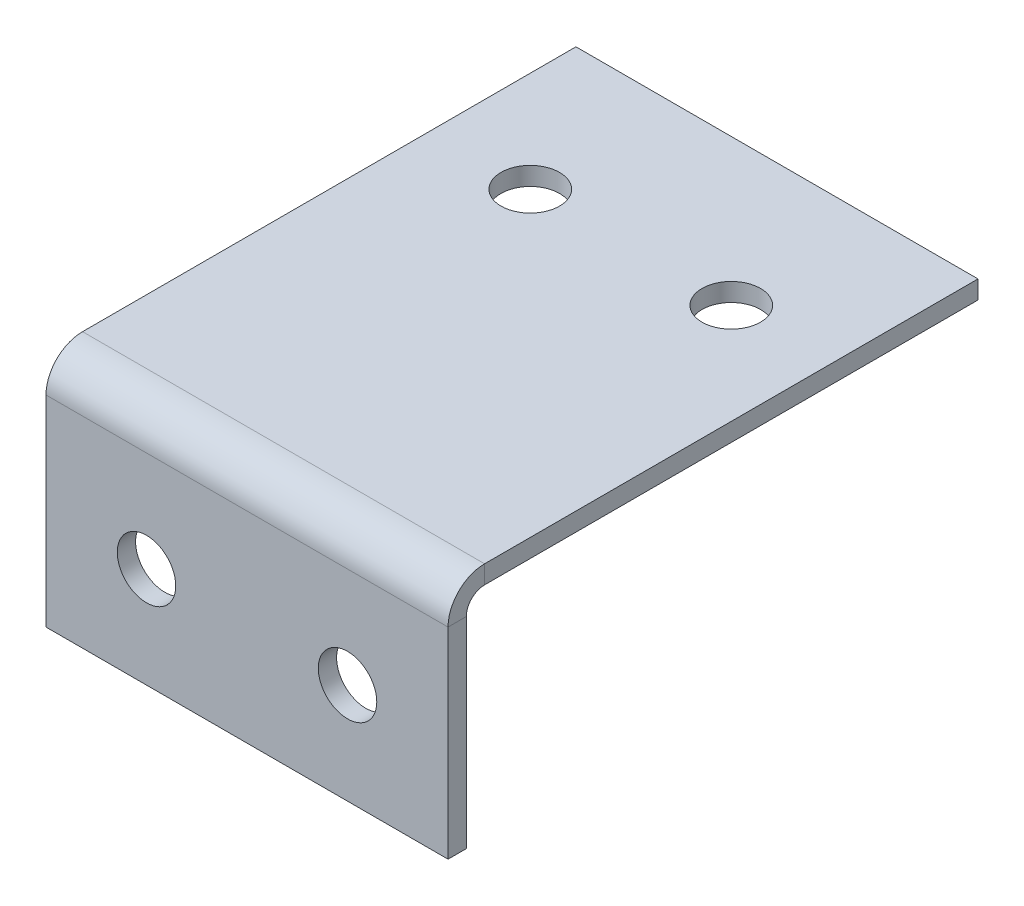
ISO-10303-21;
HEADER;
FILE_DESCRIPTION(('STEP AP214'),'2;1');
FILE_NAME('part.step','',(''),(''),'','','');
FILE_SCHEMA(('AUTOMOTIVE_DESIGN { 1 0 10303 214 1 1 1 1 }'));
ENDSEC;
DATA;
#1=APPLICATION_CONTEXT('core data for automotive mechanical design processes');
#2=APPLICATION_PROTOCOL_DEFINITION('international standard','automotive_design',2000,#1);
#3=PRODUCT_CONTEXT('',#1,'mechanical');
#4=PRODUCT('Part','Part','',(#3));
#5=PRODUCT_RELATED_PRODUCT_CATEGORY('part','',(#4));
#6=PRODUCT_DEFINITION_FORMATION('','',#4);
#7=PRODUCT_DEFINITION_CONTEXT('part definition',#1,'design');
#8=PRODUCT_DEFINITION('design','',#6,#7);
#9=PRODUCT_DEFINITION_SHAPE('','',#8);
#10=(LENGTH_UNIT() NAMED_UNIT(*) SI_UNIT(.MILLI.,.METRE.));
#11=(NAMED_UNIT(*) PLANE_ANGLE_UNIT() SI_UNIT($,.RADIAN.));
#12=(NAMED_UNIT(*) SI_UNIT($,.STERADIAN.) SOLID_ANGLE_UNIT());
#13=UNCERTAINTY_MEASURE_WITH_UNIT(LENGTH_MEASURE(1.E-05),#10,'distance_accuracy_value','');
#14=(GEOMETRIC_REPRESENTATION_CONTEXT(3) GLOBAL_UNCERTAINTY_ASSIGNED_CONTEXT((#13)) GLOBAL_UNIT_ASSIGNED_CONTEXT((#10,
#11,#12)) REPRESENTATION_CONTEXT('',''));
#15=CARTESIAN_POINT('',(0.,0.,0.));
#16=DIRECTION('',(0.,0.,1.));
#17=DIRECTION('',(1.,0.,0.));
#18=AXIS2_PLACEMENT_3D('',#15,#16,#17);
#19=CARTESIAN_POINT('',(-17.4625,19.05,-1.5875));
#20=DIRECTION('',(-1.,0.,0.));
#21=DIRECTION('',(0.,0.,1.));
#22=AXIS2_PLACEMENT_3D('',#19,#20,#21);
#23=PLANE('',#22);
#24=DIRECTION('',(0.,1.,0.));
#25=VECTOR('',#24,1.);
#26=CARTESIAN_POINT('',(-17.4625,19.05,-1.5875));
#27=LINE('',#26,#25);
#28=CARTESIAN_POINT('',(-17.4625,19.05,-1.5875));
#29=VERTEX_POINT('',#28);
#30=CARTESIAN_POINT('',(-17.4625,20.6375,-1.5875));
#31=VERTEX_POINT('',#30);
#32=EDGE_CURVE('E11',#29,#31,#27,.T.);
#33=ORIENTED_EDGE('',*,*,#32,.F.);
#34=CARTESIAN_POINT('',(-17.4625,17.4625,-1.5875));
#35=DIRECTION('',(1.,0.,0.));
#36=DIRECTION('',(0.,0.,-1.));
#37=AXIS2_PLACEMENT_3D('',#34,#35,#36);
#38=CIRCLE('',#37,1.5875);
#39=CARTESIAN_POINT('',(-17.4625,17.4625,0.));
#40=VERTEX_POINT('',#39);
#41=EDGE_CURVE('E135',#40,#29,#38,.F.);
#42=ORIENTED_EDGE('',*,*,#41,.F.);
#43=DIRECTION('',(0.,0.,-1.));
#44=VECTOR('',#43,1.);
#45=CARTESIAN_POINT('',(-17.4625,17.4625,1.5875));
#46=LINE('',#45,#44);
#47=CARTESIAN_POINT('',(-17.4625,17.4625,1.5875));
#48=VERTEX_POINT('',#47);
#49=EDGE_CURVE('E46',#48,#40,#46,.T.);
#50=ORIENTED_EDGE('',*,*,#49,.F.);
#51=CARTESIAN_POINT('',(-17.4625,17.4625,-1.5875));
#52=DIRECTION('',(1.,0.,0.));
#53=DIRECTION('',(0.,0.,-1.));
#54=AXIS2_PLACEMENT_3D('',#51,#52,#53);
#55=CIRCLE('',#54,3.175);
#56=EDGE_CURVE('E188',#48,#31,#55,.F.);
#57=ORIENTED_EDGE('',*,*,#56,.T.);
#58=EDGE_LOOP('',(#33,#42,#50,#57));
#59=FACE_BOUND('',#58,.T.);
#60=ADVANCED_FACE('F38',(#59),#23,.T.);
#61=CARTESIAN_POINT('',(-17.4625,17.4625,1.5875));
#62=DIRECTION('',(-1.,0.,0.));
#63=DIRECTION('',(0.,0.,1.));
#64=AXIS2_PLACEMENT_3D('',#61,#62,#63);
#65=PLANE('',#64);
#66=DIRECTION('',(0.,0.,-1.));
#67=VECTOR('',#66,1.);
#68=CARTESIAN_POINT('',(-17.4625,19.05,0.));
#69=LINE('',#68,#67);
#70=CARTESIAN_POINT('',(-17.4625,19.05,-44.45));
#71=VERTEX_POINT('',#70);
#72=EDGE_CURVE('E161',#29,#71,#69,.T.);
#73=ORIENTED_EDGE('',*,*,#72,.F.);
#74=ORIENTED_EDGE('',*,*,#32,.T.);
#75=DIRECTION('',(0.,0.,-1.));
#76=VECTOR('',#75,1.);
#77=CARTESIAN_POINT('',(-17.4625,20.6375,0.));
#78=LINE('',#77,#76);
#79=CARTESIAN_POINT('',(-17.4625,20.6375,-44.45));
#80=VERTEX_POINT('',#79);
#81=EDGE_CURVE('E204',#31,#80,#78,.T.);
#82=ORIENTED_EDGE('',*,*,#81,.T.);
#83=DIRECTION('',(0.,-1.,0.));
#84=VECTOR('',#83,1.);
#85=CARTESIAN_POINT('',(-17.4625,20.6375,-44.45));
#86=LINE('',#85,#84);
#87=EDGE_CURVE('E97',#80,#71,#86,.T.);
#88=ORIENTED_EDGE('',*,*,#87,.T.);
#89=EDGE_LOOP('',(#73,#74,#82,#88));
#90=FACE_BOUND('',#89,.T.);
#91=ADVANCED_FACE('F260',(#90),#65,.T.);
#92=CARTESIAN_POINT('',(17.4625,17.4625,0.));
#93=DIRECTION('',(1.,0.,0.));
#94=DIRECTION('',(0.,0.,-1.));
#95=AXIS2_PLACEMENT_3D('',#92,#93,#94);
#96=PLANE('',#95);
#97=DIRECTION('',(0.,0.,1.));
#98=VECTOR('',#97,1.);
#99=CARTESIAN_POINT('',(17.4625,17.4625,0.));
#100=LINE('',#99,#98);
#101=CARTESIAN_POINT('',(17.4625,17.4625,0.));
#102=VERTEX_POINT('',#101);
#103=CARTESIAN_POINT('',(17.4625,17.4625,1.5875));
#104=VERTEX_POINT('',#103);
#105=EDGE_CURVE('E81',#102,#104,#100,.T.);
#106=ORIENTED_EDGE('',*,*,#105,.F.);
#107=CARTESIAN_POINT('',(17.4625,17.4625,-1.5875));
#108=DIRECTION('',(1.,0.,0.));
#109=DIRECTION('',(0.,0.,-1.));
#110=AXIS2_PLACEMENT_3D('',#107,#108,#109);
#111=CIRCLE('',#110,1.5875);
#112=CARTESIAN_POINT('',(17.4625,19.05,-1.5875));
#113=VERTEX_POINT('',#112);
#114=EDGE_CURVE('E159',#102,#113,#111,.F.);
#115=ORIENTED_EDGE('',*,*,#114,.T.);
#116=DIRECTION('',(0.,-1.,0.));
#117=VECTOR('',#116,1.);
#118=CARTESIAN_POINT('',(17.4625,20.6375,-1.5875));
#119=LINE('',#118,#117);
#120=CARTESIAN_POINT('',(17.4625,20.6375,-1.5875));
#121=VERTEX_POINT('',#120);
#122=EDGE_CURVE('E88',#121,#113,#119,.T.);
#123=ORIENTED_EDGE('',*,*,#122,.F.);
#124=CARTESIAN_POINT('',(17.4625,17.4625,-1.5875));
#125=DIRECTION('',(1.,0.,0.));
#126=DIRECTION('',(0.,0.,-1.));
#127=AXIS2_PLACEMENT_3D('',#124,#125,#126);
#128=CIRCLE('',#127,3.175);
#129=EDGE_CURVE('E150',#104,#121,#128,.F.);
#130=ORIENTED_EDGE('',*,*,#129,.F.);
#131=EDGE_LOOP('',(#106,#115,#123,#130));
#132=FACE_BOUND('',#131,.T.);
#133=ADVANCED_FACE('F189',(#132),#96,.T.);
#134=CARTESIAN_POINT('',(17.4625,20.6375,-1.5875));
#135=DIRECTION('',(1.,0.,0.));
#136=DIRECTION('',(0.,0.,-1.));
#137=AXIS2_PLACEMENT_3D('',#134,#135,#136);
#138=PLANE('',#137);
#139=DIRECTION('',(0.,1.,0.));
#140=VECTOR('',#139,1.);
#141=CARTESIAN_POINT('',(17.4625,0.,0.));
#142=LINE('',#141,#140);
#143=CARTESIAN_POINT('',(17.4625,0.,0.));
#144=VERTEX_POINT('',#143);
#145=EDGE_CURVE('E118',#144,#102,#142,.T.);
#146=ORIENTED_EDGE('',*,*,#145,.T.);
#147=ORIENTED_EDGE('',*,*,#105,.T.);
#148=DIRECTION('',(0.,1.,0.));
#149=VECTOR('',#148,1.);
#150=CARTESIAN_POINT('',(17.4625,0.,1.5875));
#151=LINE('',#150,#149);
#152=CARTESIAN_POINT('',(17.4625,0.,1.5875));
#153=VERTEX_POINT('',#152);
#154=EDGE_CURVE('E153',#153,#104,#151,.T.);
#155=ORIENTED_EDGE('',*,*,#154,.F.);
#156=DIRECTION('',(0.,0.,1.));
#157=VECTOR('',#156,1.);
#158=CARTESIAN_POINT('',(17.4625,0.,0.));
#159=LINE('',#158,#157);
#160=EDGE_CURVE('E156',#144,#153,#159,.T.);
#161=ORIENTED_EDGE('',*,*,#160,.F.);
#162=EDGE_LOOP('',(#146,#147,#155,#161));
#163=FACE_BOUND('',#162,.T.);
#164=ADVANCED_FACE('F179',(#163),#138,.T.);
#165=CARTESIAN_POINT('',(-17.4625,19.05,0.));
#166=DIRECTION('',(0.,-1.,0.));
#167=DIRECTION('',(0.,0.,-1.));
#168=AXIS2_PLACEMENT_3D('',#165,#166,#167);
#169=PLANE('',#168);
#170=CARTESIAN_POINT('',(8.73125,19.05,-31.75));
#171=DIRECTION('',(0.,1.,0.));
#172=DIRECTION('',(0.,0.,1.));
#173=AXIS2_PLACEMENT_3D('',#170,#171,#172);
#174=CIRCLE('',#173,2.54);
#175=CARTESIAN_POINT('',(8.73125,19.05,-29.21));
#176=VERTEX_POINT('',#175);
#177=EDGE_CURVE('E225',#176,#176,#174,.T.);
#178=ORIENTED_EDGE('',*,*,#177,.T.);
#179=EDGE_LOOP('',(#178));
#180=FACE_BOUND('',#179,.T.);
#181=CARTESIAN_POINT('',(-8.73125,19.05,-31.75));
#182=DIRECTION('',(0.,1.,0.));
#183=DIRECTION('',(0.,0.,1.));
#184=AXIS2_PLACEMENT_3D('',#181,#182,#183);
#185=CIRCLE('',#184,2.54);
#186=CARTESIAN_POINT('',(-8.73125,19.05,-29.21));
#187=VERTEX_POINT('',#186);
#188=EDGE_CURVE('E219',#187,#187,#185,.T.);
#189=ORIENTED_EDGE('',*,*,#188,.T.);
#190=EDGE_LOOP('',(#189));
#191=FACE_BOUND('',#190,.T.);
#192=DIRECTION('',(0.,0.,-1.));
#193=VECTOR('',#192,1.);
#194=CARTESIAN_POINT('',(17.4625,19.05,0.));
#195=LINE('',#194,#193);
#196=CARTESIAN_POINT('',(17.4625,19.05,-44.45));
#197=VERTEX_POINT('',#196);
#198=EDGE_CURVE('E142',#113,#197,#195,.T.);
#199=ORIENTED_EDGE('',*,*,#198,.F.);
#200=DIRECTION('',(1.,0.,0.));
#201=VECTOR('',#200,1.);
#202=CARTESIAN_POINT('',(-17.4625,19.05,-1.5875));
#203=LINE('',#202,#201);
#204=EDGE_CURVE('E162',#29,#113,#203,.T.);
#205=ORIENTED_EDGE('',*,*,#204,.F.);
#206=ORIENTED_EDGE('',*,*,#72,.T.);
#207=DIRECTION('',(1.,0.,0.));
#208=VECTOR('',#207,1.);
#209=CARTESIAN_POINT('',(-17.4625,19.05,-44.45));
#210=LINE('',#209,#208);
#211=EDGE_CURVE('E138',#71,#197,#210,.T.);
#212=ORIENTED_EDGE('',*,*,#211,.T.);
#213=EDGE_LOOP('',(#199,#205,#206,#212));
#214=FACE_BOUND('',#213,.T.);
#215=ADVANCED_FACE('F195',(#180,#191,#214),#169,.T.);
#216=CARTESIAN_POINT('',(-17.4625,17.4625,-1.5875));
#217=DIRECTION('',(1.,0.,0.));
#218=DIRECTION('',(0.,0.,-1.));
#219=AXIS2_PLACEMENT_3D('',#216,#217,#218);
#220=CYLINDRICAL_SURFACE('',#219,1.5875);
#221=ORIENTED_EDGE('',*,*,#114,.F.);
#222=DIRECTION('',(1.,0.,0.));
#223=VECTOR('',#222,1.);
#224=CARTESIAN_POINT('',(-17.4625,17.4625,0.));
#225=LINE('',#224,#223);
#226=EDGE_CURVE('E121',#40,#102,#225,.T.);
#227=ORIENTED_EDGE('',*,*,#226,.F.);
#228=ORIENTED_EDGE('',*,*,#41,.T.);
#229=ORIENTED_EDGE('',*,*,#204,.T.);
#230=EDGE_LOOP('',(#221,#227,#228,#229));
#231=FACE_BOUND('',#230,.T.);
#232=ADVANCED_FACE('F191',(#231),#220,.F.);
#233=CARTESIAN_POINT('',(-17.4625,0.,0.));
#234=DIRECTION('',(0.,0.,-1.));
#235=DIRECTION('',(-1.,0.,0.));
#236=AXIS2_PLACEMENT_3D('',#233,#234,#235);
#237=PLANE('',#236);
#238=CARTESIAN_POINT('',(8.73125,8.73124999999999,0.));
#239=DIRECTION('',(0.,0.,1.));
#240=DIRECTION('',(1.,0.,0.));
#241=AXIS2_PLACEMENT_3D('',#238,#239,#240);
#242=CIRCLE('',#241,2.54);
#243=CARTESIAN_POINT('',(11.27125,8.73124999999999,0.));
#244=VERTEX_POINT('',#243);
#245=EDGE_CURVE('E213',#244,#244,#242,.T.);
#246=ORIENTED_EDGE('',*,*,#245,.T.);
#247=EDGE_LOOP('',(#246));
#248=FACE_BOUND('',#247,.T.);
#249=CARTESIAN_POINT('',(-8.73125,8.73124999999999,0.));
#250=DIRECTION('',(0.,0.,1.));
#251=DIRECTION('',(1.,0.,0.));
#252=AXIS2_PLACEMENT_3D('',#249,#250,#251);
#253=CIRCLE('',#252,2.54);
#254=CARTESIAN_POINT('',(-6.19125,8.73124999999999,0.));
#255=VERTEX_POINT('',#254);
#256=EDGE_CURVE('E145',#255,#255,#253,.T.);
#257=ORIENTED_EDGE('',*,*,#256,.T.);
#258=EDGE_LOOP('',(#257));
#259=FACE_BOUND('',#258,.T.);
#260=ORIENTED_EDGE('',*,*,#145,.F.);
#261=DIRECTION('',(1.,0.,0.));
#262=VECTOR('',#261,1.);
#263=CARTESIAN_POINT('',(-17.4625,0.,0.));
#264=LINE('',#263,#262);
#265=CARTESIAN_POINT('',(-17.4625,0.,0.));
#266=VERTEX_POINT('',#265);
#267=EDGE_CURVE('E112',#266,#144,#264,.T.);
#268=ORIENTED_EDGE('',*,*,#267,.F.);
#269=DIRECTION('',(0.,1.,0.));
#270=VECTOR('',#269,1.);
#271=CARTESIAN_POINT('',(-17.4625,0.,0.));
#272=LINE('',#271,#270);
#273=EDGE_CURVE('E116',#266,#40,#272,.T.);
#274=ORIENTED_EDGE('',*,*,#273,.T.);
#275=ORIENTED_EDGE('',*,*,#226,.T.);
#276=EDGE_LOOP('',(#260,#268,#274,#275));
#277=FACE_BOUND('',#276,.T.);
#278=ADVANCED_FACE('F114',(#248,#259,#277),#237,.T.);
#279=CARTESIAN_POINT('',(-17.4625,0.,0.));
#280=DIRECTION('',(0.,1.,0.));
#281=DIRECTION('',(0.,0.,1.));
#282=AXIS2_PLACEMENT_3D('',#279,#280,#281);
#283=PLANE('',#282);
#284=ORIENTED_EDGE('',*,*,#160,.T.);
#285=DIRECTION('',(1.,0.,0.));
#286=VECTOR('',#285,1.);
#287=CARTESIAN_POINT('',(-17.4625,0.,1.5875));
#288=LINE('',#287,#286);
#289=CARTESIAN_POINT('',(-17.4625,0.,1.5875));
#290=VERTEX_POINT('',#289);
#291=EDGE_CURVE('E122',#290,#153,#288,.T.);
#292=ORIENTED_EDGE('',*,*,#291,.F.);
#293=DIRECTION('',(0.,0.,1.));
#294=VECTOR('',#293,1.);
#295=CARTESIAN_POINT('',(-17.4625,0.,0.));
#296=LINE('',#295,#294);
#297=EDGE_CURVE('E125',#266,#290,#296,.T.);
#298=ORIENTED_EDGE('',*,*,#297,.F.);
#299=ORIENTED_EDGE('',*,*,#267,.T.);
#300=EDGE_LOOP('',(#284,#292,#298,#299));
#301=FACE_BOUND('',#300,.T.);
#302=ADVANCED_FACE('F126',(#301),#283,.F.);
#303=CARTESIAN_POINT('',(-17.4625,0.,1.5875));
#304=DIRECTION('',(0.,0.,-1.));
#305=DIRECTION('',(-1.,0.,0.));
#306=AXIS2_PLACEMENT_3D('',#303,#304,#305);
#307=PLANE('',#306);
#308=CARTESIAN_POINT('',(8.73125,8.73124999999999,1.5875));
#309=DIRECTION('',(0.,0.,1.));
#310=DIRECTION('',(1.,0.,0.));
#311=AXIS2_PLACEMENT_3D('',#308,#309,#310);
#312=CIRCLE('',#311,2.54);
#313=CARTESIAN_POINT('',(11.27125,8.73124999999999,1.5875));
#314=VERTEX_POINT('',#313);
#315=EDGE_CURVE('E216',#314,#314,#312,.T.);
#316=ORIENTED_EDGE('',*,*,#315,.F.);
#317=EDGE_LOOP('',(#316));
#318=FACE_BOUND('',#317,.T.);
#319=CARTESIAN_POINT('',(-8.73125,8.73124999999999,1.5875));
#320=DIRECTION('',(0.,0.,1.));
#321=DIRECTION('',(1.,0.,0.));
#322=AXIS2_PLACEMENT_3D('',#319,#320,#321);
#323=CIRCLE('',#322,2.54);
#324=CARTESIAN_POINT('',(-6.19125,8.73124999999999,1.5875));
#325=VERTEX_POINT('',#324);
#326=EDGE_CURVE('E210',#325,#325,#323,.T.);
#327=ORIENTED_EDGE('',*,*,#326,.F.);
#328=EDGE_LOOP('',(#327));
#329=FACE_BOUND('',#328,.T.);
#330=ORIENTED_EDGE('',*,*,#154,.T.);
#331=DIRECTION('',(1.,0.,0.));
#332=VECTOR('',#331,1.);
#333=CARTESIAN_POINT('',(-17.4625,17.4625,1.5875));
#334=LINE('',#333,#332);
#335=EDGE_CURVE('E166',#48,#104,#334,.T.);
#336=ORIENTED_EDGE('',*,*,#335,.F.);
#337=DIRECTION('',(0.,1.,0.));
#338=VECTOR('',#337,1.);
#339=CARTESIAN_POINT('',(-17.4625,0.,1.5875));
#340=LINE('',#339,#338);
#341=EDGE_CURVE('E131',#290,#48,#340,.T.);
#342=ORIENTED_EDGE('',*,*,#341,.F.);
#343=ORIENTED_EDGE('',*,*,#291,.T.);
#344=EDGE_LOOP('',(#330,#336,#342,#343));
#345=FACE_BOUND('',#344,.T.);
#346=ADVANCED_FACE('F183',(#318,#329,#345),#307,.F.);
#347=CARTESIAN_POINT('',(-17.4625,17.4625,-1.5875));
#348=DIRECTION('',(1.,0.,0.));
#349=DIRECTION('',(0.,0.,-1.));
#350=AXIS2_PLACEMENT_3D('',#347,#348,#349);
#351=CYLINDRICAL_SURFACE('',#350,3.175);
#352=ORIENTED_EDGE('',*,*,#129,.T.);
#353=DIRECTION('',(1.,0.,0.));
#354=VECTOR('',#353,1.);
#355=CARTESIAN_POINT('',(-17.4625,20.6375,-1.5875));
#356=LINE('',#355,#354);
#357=EDGE_CURVE('E169',#31,#121,#356,.T.);
#358=ORIENTED_EDGE('',*,*,#357,.F.);
#359=ORIENTED_EDGE('',*,*,#56,.F.);
#360=ORIENTED_EDGE('',*,*,#335,.T.);
#361=EDGE_LOOP('',(#352,#358,#359,#360));
#362=FACE_BOUND('',#361,.T.);
#363=ADVANCED_FACE('F186',(#362),#351,.T.);
#364=CARTESIAN_POINT('',(-17.4625,20.6375,0.));
#365=DIRECTION('',(0.,-1.,0.));
#366=DIRECTION('',(0.,0.,-1.));
#367=AXIS2_PLACEMENT_3D('',#364,#365,#366);
#368=PLANE('',#367);
#369=CARTESIAN_POINT('',(8.73125,20.6375,-31.75));
#370=DIRECTION('',(0.,1.,0.));
#371=DIRECTION('',(0.,0.,1.));
#372=AXIS2_PLACEMENT_3D('',#369,#370,#371);
#373=CIRCLE('',#372,2.54);
#374=CARTESIAN_POINT('',(8.73125,20.6375,-29.21));
#375=VERTEX_POINT('',#374);
#376=EDGE_CURVE('E228',#375,#375,#373,.T.);
#377=ORIENTED_EDGE('',*,*,#376,.F.);
#378=EDGE_LOOP('',(#377));
#379=FACE_BOUND('',#378,.T.);
#380=CARTESIAN_POINT('',(-8.73125,20.6375,-31.75));
#381=DIRECTION('',(0.,1.,0.));
#382=DIRECTION('',(0.,0.,1.));
#383=AXIS2_PLACEMENT_3D('',#380,#381,#382);
#384=CIRCLE('',#383,2.54);
#385=CARTESIAN_POINT('',(-8.73125,20.6375,-29.21));
#386=VERTEX_POINT('',#385);
#387=EDGE_CURVE('E222',#386,#386,#384,.T.);
#388=ORIENTED_EDGE('',*,*,#387,.F.);
#389=EDGE_LOOP('',(#388));
#390=FACE_BOUND('',#389,.T.);
#391=DIRECTION('',(0.,0.,-1.));
#392=VECTOR('',#391,1.);
#393=CARTESIAN_POINT('',(17.4625,20.6375,0.));
#394=LINE('',#393,#392);
#395=CARTESIAN_POINT('',(17.4625,20.6375,-44.45));
#396=VERTEX_POINT('',#395);
#397=EDGE_CURVE('E148',#121,#396,#394,.T.);
#398=ORIENTED_EDGE('',*,*,#397,.T.);
#399=DIRECTION('',(1.,0.,0.));
#400=VECTOR('',#399,1.);
#401=CARTESIAN_POINT('',(-17.4625,20.6375,-44.45));
#402=LINE('',#401,#400);
#403=EDGE_CURVE('E172',#80,#396,#402,.T.);
#404=ORIENTED_EDGE('',*,*,#403,.F.);
#405=ORIENTED_EDGE('',*,*,#81,.F.);
#406=ORIENTED_EDGE('',*,*,#357,.T.);
#407=EDGE_LOOP('',(#398,#404,#405,#406));
#408=FACE_BOUND('',#407,.T.);
#409=ADVANCED_FACE('F203',(#379,#390,#408),#368,.F.);
#410=CARTESIAN_POINT('',(-17.4625,20.6375,-44.45));
#411=DIRECTION('',(0.,0.,1.));
#412=DIRECTION('',(1.,0.,0.));
#413=AXIS2_PLACEMENT_3D('',#410,#411,#412);
#414=PLANE('',#413);
#415=DIRECTION('',(0.,-1.,0.));
#416=VECTOR('',#415,1.);
#417=CARTESIAN_POINT('',(17.4625,20.6375,-44.45));
#418=LINE('',#417,#416);
#419=EDGE_CURVE('E144',#396,#197,#418,.T.);
#420=ORIENTED_EDGE('',*,*,#419,.T.);
#421=ORIENTED_EDGE('',*,*,#211,.F.);
#422=ORIENTED_EDGE('',*,*,#87,.F.);
#423=ORIENTED_EDGE('',*,*,#403,.T.);
#424=EDGE_LOOP('',(#420,#421,#422,#423));
#425=FACE_BOUND('',#424,.T.);
#426=ADVANCED_FACE('F199',(#425),#414,.F.);
#427=CARTESIAN_POINT('',(-17.4625,17.4625,-1.5875));
#428=DIRECTION('',(1.,0.,0.));
#429=DIRECTION('',(0.,0.,-1.));
#430=AXIS2_PLACEMENT_3D('',#427,#428,#429);
#431=PLANE('',#430);
#432=ORIENTED_EDGE('',*,*,#341,.T.);
#433=ORIENTED_EDGE('',*,*,#49,.T.);
#434=ORIENTED_EDGE('',*,*,#273,.F.);
#435=ORIENTED_EDGE('',*,*,#297,.T.);
#436=EDGE_LOOP('',(#432,#433,#434,#435));
#437=FACE_BOUND('',#436,.T.);
#438=ADVANCED_FACE('F133',(#437),#431,.F.);
#439=CARTESIAN_POINT('',(17.4625,17.4625,-1.5875));
#440=DIRECTION('',(1.,0.,0.));
#441=DIRECTION('',(0.,0.,-1.));
#442=AXIS2_PLACEMENT_3D('',#439,#440,#441);
#443=PLANE('',#442);
#444=ORIENTED_EDGE('',*,*,#198,.T.);
#445=ORIENTED_EDGE('',*,*,#419,.F.);
#446=ORIENTED_EDGE('',*,*,#397,.F.);
#447=ORIENTED_EDGE('',*,*,#122,.T.);
#448=EDGE_LOOP('',(#444,#445,#446,#447));
#449=FACE_BOUND('',#448,.T.);
#450=ADVANCED_FACE('F197',(#449),#443,.T.);
#451=CARTESIAN_POINT('',(-8.73125,8.73124999999999,0.));
#452=DIRECTION('',(0.,0.,1.));
#453=DIRECTION('',(1.,0.,0.));
#454=AXIS2_PLACEMENT_3D('',#451,#452,#453);
#455=CYLINDRICAL_SURFACE('',#454,2.54);
#456=ORIENTED_EDGE('',*,*,#256,.F.);
#457=EDGE_LOOP('',(#456));
#458=FACE_BOUND('',#457,.T.);
#459=ORIENTED_EDGE('',*,*,#326,.T.);
#460=EDGE_LOOP('',(#459));
#461=FACE_BOUND('',#460,.T.);
#462=ADVANCED_FACE('F255',(#458,#461),#455,.F.);
#463=CARTESIAN_POINT('',(8.73125,8.73124999999999,0.));
#464=DIRECTION('',(0.,0.,1.));
#465=DIRECTION('',(1.,0.,0.));
#466=AXIS2_PLACEMENT_3D('',#463,#464,#465);
#467=CYLINDRICAL_SURFACE('',#466,2.54);
#468=ORIENTED_EDGE('',*,*,#245,.F.);
#469=EDGE_LOOP('',(#468));
#470=FACE_BOUND('',#469,.T.);
#471=ORIENTED_EDGE('',*,*,#315,.T.);
#472=EDGE_LOOP('',(#471));
#473=FACE_BOUND('',#472,.T.);
#474=ADVANCED_FACE('F249',(#470,#473),#467,.F.);
#475=CARTESIAN_POINT('',(-8.73125,19.05,-31.75));
#476=DIRECTION('',(0.,1.,0.));
#477=DIRECTION('',(0.,0.,1.));
#478=AXIS2_PLACEMENT_3D('',#475,#476,#477);
#479=CYLINDRICAL_SURFACE('',#478,2.54);
#480=ORIENTED_EDGE('',*,*,#188,.F.);
#481=EDGE_LOOP('',(#480));
#482=FACE_BOUND('',#481,.T.);
#483=ORIENTED_EDGE('',*,*,#387,.T.);
#484=EDGE_LOOP('',(#483));
#485=FACE_BOUND('',#484,.T.);
#486=ADVANCED_FACE('F239',(#482,#485),#479,.F.);
#487=CARTESIAN_POINT('',(8.73125,19.05,-31.75));
#488=DIRECTION('',(0.,1.,0.));
#489=DIRECTION('',(0.,0.,1.));
#490=AXIS2_PLACEMENT_3D('',#487,#488,#489);
#491=CYLINDRICAL_SURFACE('',#490,2.54);
#492=ORIENTED_EDGE('',*,*,#177,.F.);
#493=EDGE_LOOP('',(#492));
#494=FACE_BOUND('',#493,.T.);
#495=ORIENTED_EDGE('',*,*,#376,.T.);
#496=EDGE_LOOP('',(#495));
#497=FACE_BOUND('',#496,.T.);
#498=ADVANCED_FACE('F236',(#494,#497),#491,.F.);
#499=CLOSED_SHELL('',(#60,#91,#133,#164,#215,#232,#278,#302,#346,#363,#409,#426,#438,#450,#462,
#474,#486,#498));
#500=MANIFOLD_SOLID_BREP('B2',#499);
#501=ADVANCED_BREP_SHAPE_REPRESENTATION('',(#18,#500),#14);
#502=SHAPE_DEFINITION_REPRESENTATION(#9,#501);
ENDSEC;
END-ISO-10303-21;
